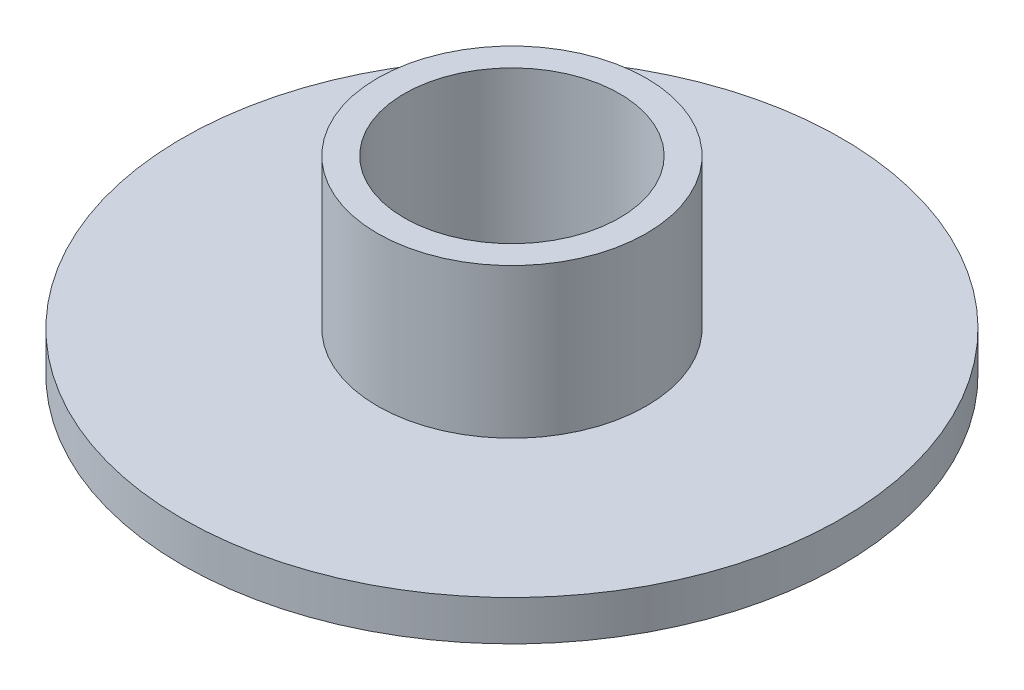
ISO-10303-21;
HEADER;
FILE_DESCRIPTION(('STEP AP214'),'2;1');
FILE_NAME('part.step','',(''),(''),'','','');
FILE_SCHEMA(('AUTOMOTIVE_DESIGN { 1 0 10303 214 1 1 1 1 }'));
ENDSEC;
DATA;
#1=APPLICATION_CONTEXT('core data for automotive mechanical design processes');
#2=APPLICATION_PROTOCOL_DEFINITION('international standard','automotive_design',2000,#1);
#3=PRODUCT_CONTEXT('',#1,'mechanical');
#4=PRODUCT('Part','Part','',(#3));
#5=PRODUCT_RELATED_PRODUCT_CATEGORY('part','',(#4));
#6=PRODUCT_DEFINITION_FORMATION('','',#4);
#7=PRODUCT_DEFINITION_CONTEXT('part definition',#1,'design');
#8=PRODUCT_DEFINITION('design','',#6,#7);
#9=PRODUCT_DEFINITION_SHAPE('','',#8);
#10=(LENGTH_UNIT() NAMED_UNIT(*) SI_UNIT(.MILLI.,.METRE.));
#11=(NAMED_UNIT(*) PLANE_ANGLE_UNIT() SI_UNIT($,.RADIAN.));
#12=(NAMED_UNIT(*) SI_UNIT($,.STERADIAN.) SOLID_ANGLE_UNIT());
#13=UNCERTAINTY_MEASURE_WITH_UNIT(LENGTH_MEASURE(1.E-05),#10,'distance_accuracy_value','');
#14=(GEOMETRIC_REPRESENTATION_CONTEXT(3) GLOBAL_UNCERTAINTY_ASSIGNED_CONTEXT((#13)) GLOBAL_UNIT_ASSIGNED_CONTEXT((#10,
#11,#12)) REPRESENTATION_CONTEXT('',''));
#15=CARTESIAN_POINT('',(0.,0.,0.));
#16=DIRECTION('',(0.,0.,1.));
#17=DIRECTION('',(1.,0.,0.));
#18=AXIS2_PLACEMENT_3D('',#15,#16,#17);
#19=CARTESIAN_POINT('',(-25.5258196376482,53.4267640572131,0.));
#20=DIRECTION('',(0.,1.,0.));
#21=DIRECTION('',(0.,0.,1.));
#22=AXIS2_PLACEMENT_3D('',#19,#20,#21);
#23=CYLINDRICAL_SURFACE('',#22,25.5258196376482);
#24=CARTESIAN_POINT('',(-25.5258196376482,0.,0.));
#25=DIRECTION('',(0.,1.,0.));
#26=DIRECTION('',(0.,0.,1.));
#27=AXIS2_PLACEMENT_3D('',#24,#25,#26);
#28=CIRCLE('',#27,25.5258196376482);
#29=CARTESIAN_POINT('',(-25.5258196376482,0.,25.5258196376482));
#30=VERTEX_POINT('',#29);
#31=EDGE_CURVE('E10',#30,#30,#28,.T.);
#32=ORIENTED_EDGE('',*,*,#31,.F.);
#33=EDGE_LOOP('',(#32));
#34=FACE_BOUND('',#33,.T.);
#35=CARTESIAN_POINT('',(-25.5258196376482,44.9689980759655,0.));
#36=DIRECTION('',(0.,1.,0.));
#37=DIRECTION('',(0.,0.,1.));
#38=AXIS2_PLACEMENT_3D('',#35,#36,#37);
#39=CIRCLE('',#38,25.5258196376482);
#40=CARTESIAN_POINT('',(-25.5258196376482,44.9689980759655,25.5258196376482));
#41=VERTEX_POINT('',#40);
#42=EDGE_CURVE('E51',#41,#41,#39,.T.);
#43=ORIENTED_EDGE('',*,*,#42,.T.);
#44=EDGE_LOOP('',(#43));
#45=FACE_BOUND('',#44,.T.);
#46=ADVANCED_FACE('F29',(#34,#45),#23,.F.);
#47=CARTESIAN_POINT('',(0.,0.,0.));
#48=DIRECTION('',(0.,1.,0.));
#49=DIRECTION('',(0.,0.,1.));
#50=AXIS2_PLACEMENT_3D('',#47,#48,#49);
#51=PLANE('',#50);
#52=CARTESIAN_POINT('',(-25.5258196376482,0.,0.));
#53=DIRECTION('',(0.,1.,0.));
#54=DIRECTION('',(0.,0.,1.));
#55=AXIS2_PLACEMENT_3D('',#52,#53,#54);
#56=CIRCLE('',#55,78.1230489320499);
#57=CARTESIAN_POINT('',(-25.5258196376482,0.,78.1230489320499));
#58=VERTEX_POINT('',#57);
#59=EDGE_CURVE('E35',#58,#58,#56,.T.);
#60=ORIENTED_EDGE('',*,*,#59,.F.);
#61=EDGE_LOOP('',(#60));
#62=FACE_BOUND('',#61,.T.);
#63=ORIENTED_EDGE('',*,*,#31,.T.);
#64=EDGE_LOOP('',(#63));
#65=FACE_BOUND('',#64,.T.);
#66=ADVANCED_FACE('F76',(#62,#65),#51,.F.);
#67=CARTESIAN_POINT('',(-25.5258196376482,53.4267640572131,0.));
#68=DIRECTION('',(0.,1.,0.));
#69=DIRECTION('',(0.,0.,1.));
#70=AXIS2_PLACEMENT_3D('',#67,#68,#69);
#71=CYLINDRICAL_SURFACE('',#70,78.1230489320499);
#72=CARTESIAN_POINT('',(-25.5258196376482,9.525,0.));
#73=DIRECTION('',(0.,1.,0.));
#74=DIRECTION('',(0.,0.,1.));
#75=AXIS2_PLACEMENT_3D('',#72,#73,#74);
#76=CIRCLE('',#75,78.1230489320499);
#77=CARTESIAN_POINT('',(-25.5258196376482,9.525,78.1230489320499));
#78=VERTEX_POINT('',#77);
#79=EDGE_CURVE('E39',#78,#78,#76,.T.);
#80=ORIENTED_EDGE('',*,*,#79,.F.);
#81=EDGE_LOOP('',(#80));
#82=FACE_BOUND('',#81,.T.);
#83=ORIENTED_EDGE('',*,*,#59,.T.);
#84=EDGE_LOOP('',(#83));
#85=FACE_BOUND('',#84,.T.);
#86=ADVANCED_FACE('F71',(#82,#85),#71,.T.);
#87=CARTESIAN_POINT('',(52.5972292944017,9.525,0.));
#88=DIRECTION('',(0.,-1.,0.));
#89=DIRECTION('',(0.,0.,-1.));
#90=AXIS2_PLACEMENT_3D('',#87,#88,#89);
#91=PLANE('',#90);
#92=CARTESIAN_POINT('',(-25.5258196376482,9.52499999999999,0.));
#93=DIRECTION('',(0.,1.,0.));
#94=DIRECTION('',(0.,0.,1.));
#95=AXIS2_PLACEMENT_3D('',#92,#93,#94);
#96=CIRCLE('',#95,31.8758196376482);
#97=CARTESIAN_POINT('',(-25.5258196376482,9.52499999999999,31.8758196376482));
#98=VERTEX_POINT('',#97);
#99=EDGE_CURVE('E43',#98,#98,#96,.T.);
#100=ORIENTED_EDGE('',*,*,#99,.F.);
#101=EDGE_LOOP('',(#100));
#102=FACE_BOUND('',#101,.T.);
#103=ORIENTED_EDGE('',*,*,#79,.T.);
#104=EDGE_LOOP('',(#103));
#105=FACE_BOUND('',#104,.T.);
#106=ADVANCED_FACE('F65',(#102,#105),#91,.F.);
#107=CARTESIAN_POINT('',(-25.5258196376482,53.4267640572131,0.));
#108=DIRECTION('',(0.,1.,0.));
#109=DIRECTION('',(0.,0.,1.));
#110=AXIS2_PLACEMENT_3D('',#107,#108,#109);
#111=CYLINDRICAL_SURFACE('',#110,31.8758196376482);
#112=CARTESIAN_POINT('',(-25.5258196376482,44.9689980759655,0.));
#113=DIRECTION('',(0.,1.,0.));
#114=DIRECTION('',(0.,0.,1.));
#115=AXIS2_PLACEMENT_3D('',#112,#113,#114);
#116=CIRCLE('',#115,31.8758196376482);
#117=CARTESIAN_POINT('',(-25.5258196376482,44.9689980759655,31.8758196376482));
#118=VERTEX_POINT('',#117);
#119=EDGE_CURVE('E48',#118,#118,#116,.T.);
#120=ORIENTED_EDGE('',*,*,#119,.F.);
#121=EDGE_LOOP('',(#120));
#122=FACE_BOUND('',#121,.T.);
#123=ORIENTED_EDGE('',*,*,#99,.T.);
#124=EDGE_LOOP('',(#123));
#125=FACE_BOUND('',#124,.T.);
#126=ADVANCED_FACE('F59',(#122,#125),#111,.T.);
#127=CARTESIAN_POINT('',(6.35,44.9689980759655,0.));
#128=DIRECTION('',(0.,-1.,0.));
#129=DIRECTION('',(0.,0.,-1.));
#130=AXIS2_PLACEMENT_3D('',#127,#128,#129);
#131=PLANE('',#130);
#132=ORIENTED_EDGE('',*,*,#42,.F.);
#133=EDGE_LOOP('',(#132));
#134=FACE_BOUND('',#133,.T.);
#135=ORIENTED_EDGE('',*,*,#119,.T.);
#136=EDGE_LOOP('',(#135));
#137=FACE_BOUND('',#136,.T.);
#138=ADVANCED_FACE('F56',(#134,#137),#131,.F.);
#139=CLOSED_SHELL('',(#46,#66,#86,#106,#126,#138));
#140=MANIFOLD_SOLID_BREP('B2',#139);
#141=ADVANCED_BREP_SHAPE_REPRESENTATION('',(#18,#140),#14);
#142=SHAPE_DEFINITION_REPRESENTATION(#9,#141);
ENDSEC;
END-ISO-10303-21;
